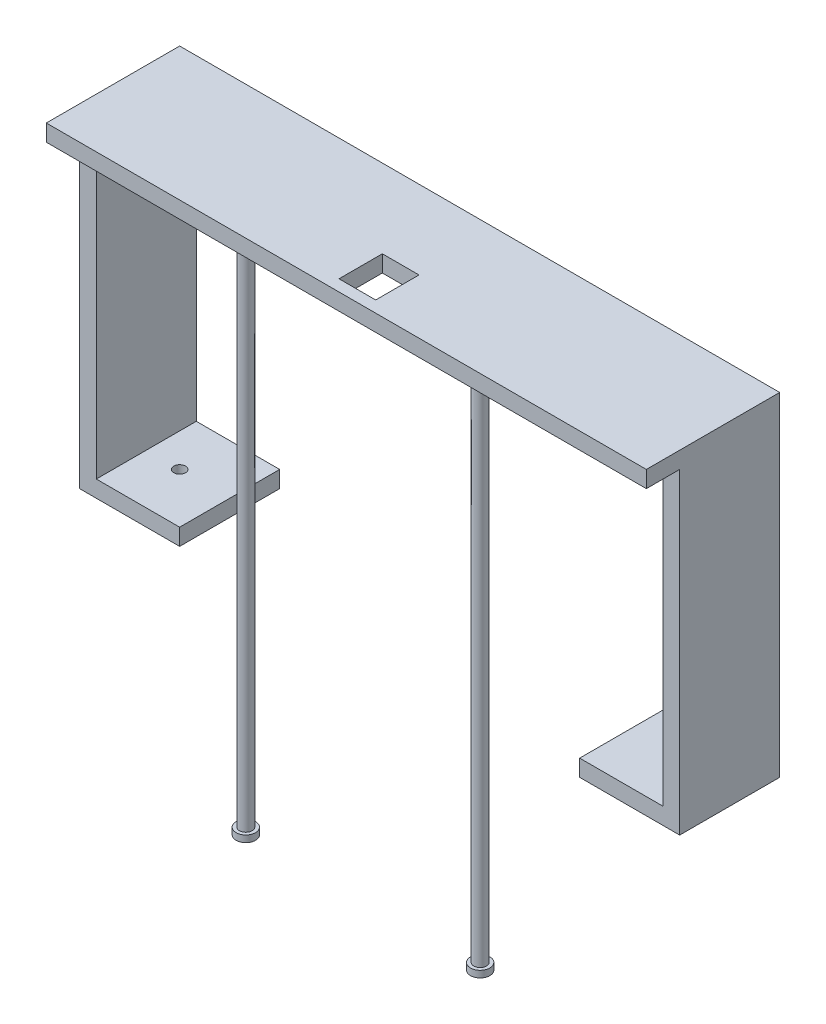
ISO-10303-21;
HEADER;
FILE_DESCRIPTION(('STEP AP214'),'2;1');
FILE_NAME('part.step','',(''),(''),'','','');
FILE_SCHEMA(('AUTOMOTIVE_DESIGN { 1 0 10303 214 1 1 1 1 }'));
ENDSEC;
DATA;
#1=APPLICATION_CONTEXT('core data for automotive mechanical design processes');
#2=APPLICATION_PROTOCOL_DEFINITION('international standard','automotive_design',2000,#1);
#3=PRODUCT_CONTEXT('',#1,'mechanical');
#4=PRODUCT('Part','Part','',(#3));
#5=PRODUCT_RELATED_PRODUCT_CATEGORY('part','',(#4));
#6=PRODUCT_DEFINITION_FORMATION('','',#4);
#7=PRODUCT_DEFINITION_CONTEXT('part definition',#1,'design');
#8=PRODUCT_DEFINITION('design','',#6,#7);
#9=PRODUCT_DEFINITION_SHAPE('','',#8);
#10=(LENGTH_UNIT() NAMED_UNIT(*) SI_UNIT(.MILLI.,.METRE.));
#11=(NAMED_UNIT(*) PLANE_ANGLE_UNIT() SI_UNIT($,.RADIAN.));
#12=(NAMED_UNIT(*) SI_UNIT($,.STERADIAN.) SOLID_ANGLE_UNIT());
#13=UNCERTAINTY_MEASURE_WITH_UNIT(LENGTH_MEASURE(1.E-05),#10,'distance_accuracy_value','');
#14=(GEOMETRIC_REPRESENTATION_CONTEXT(3) GLOBAL_UNCERTAINTY_ASSIGNED_CONTEXT((#13)) GLOBAL_UNIT_ASSIGNED_CONTEXT((#10,
#11,#12)) REPRESENTATION_CONTEXT('',''));
#15=CARTESIAN_POINT('',(0.,0.,0.));
#16=DIRECTION('',(0.,0.,1.));
#17=DIRECTION('',(1.,0.,0.));
#18=AXIS2_PLACEMENT_3D('',#15,#16,#17);
#19=CARTESIAN_POINT('',(125.15,-60.,5.00000000000001));
#20=DIRECTION('',(0.,1.,0.));
#21=DIRECTION('',(-1.,0.,0.));
#22=AXIS2_PLACEMENT_3D('',#19,#20,#21);
#23=CYLINDRICAL_SURFACE('',#22,1.9);
#24=CARTESIAN_POINT('',(125.15,95.,5.00000000000001));
#25=DIRECTION('',(0.,-1.,0.));
#26=DIRECTION('',(-1.,0.,0.));
#27=AXIS2_PLACEMENT_3D('',#24,#25,#26);
#28=CIRCLE('',#27,1.9);
#29=CARTESIAN_POINT('',(123.25,95.,5.00000000000001));
#30=VERTEX_POINT('',#29);
#31=EDGE_CURVE('E214',#30,#30,#28,.T.);
#32=ORIENTED_EDGE('',*,*,#31,.T.);
#33=EDGE_LOOP('',(#32));
#34=FACE_BOUND('',#33,.T.);
#35=CARTESIAN_POINT('',(125.15,-58.,5.00000000000001));
#36=DIRECTION('',(0.,-1.,0.));
#37=DIRECTION('',(1.,0.,0.));
#38=AXIS2_PLACEMENT_3D('',#35,#36,#37);
#39=CIRCLE('',#38,1.9);
#40=CARTESIAN_POINT('',(127.05,-58.,5.00000000000001));
#41=VERTEX_POINT('',#40);
#42=EDGE_CURVE('E11',#41,#41,#39,.T.);
#43=ORIENTED_EDGE('',*,*,#42,.F.);
#44=EDGE_LOOP('',(#43));
#45=FACE_BOUND('',#44,.T.);
#46=ADVANCED_FACE('F38',(#34,#45),#23,.T.);
#47=CARTESIAN_POINT('',(54.8500000000001,-60.,5.00000000000001));
#48=DIRECTION('',(0.,1.,0.));
#49=DIRECTION('',(-1.,0.,0.));
#50=AXIS2_PLACEMENT_3D('',#47,#48,#49);
#51=CYLINDRICAL_SURFACE('',#50,1.9);
#52=CARTESIAN_POINT('',(54.85,95.,5.00000000000001));
#53=DIRECTION('',(0.,-1.,0.));
#54=DIRECTION('',(1.,0.,0.));
#55=AXIS2_PLACEMENT_3D('',#52,#53,#54);
#56=CIRCLE('',#55,1.9);
#57=CARTESIAN_POINT('',(56.75,95.,5.00000000000001));
#58=VERTEX_POINT('',#57);
#59=EDGE_CURVE('E209',#58,#58,#56,.T.);
#60=ORIENTED_EDGE('',*,*,#59,.T.);
#61=EDGE_LOOP('',(#60));
#62=FACE_BOUND('',#61,.T.);
#63=CARTESIAN_POINT('',(54.8500000000001,-58.,5.00000000000001));
#64=DIRECTION('',(0.,-1.,0.));
#65=DIRECTION('',(1.,0.,0.));
#66=AXIS2_PLACEMENT_3D('',#63,#64,#65);
#67=CIRCLE('',#66,1.9);
#68=CARTESIAN_POINT('',(56.75,-58.,5.00000000000001));
#69=VERTEX_POINT('',#68);
#70=EDGE_CURVE('E46',#69,#69,#67,.T.);
#71=ORIENTED_EDGE('',*,*,#70,.F.);
#72=EDGE_LOOP('',(#71));
#73=FACE_BOUND('',#72,.T.);
#74=ADVANCED_FACE('F410',(#62,#73),#51,.T.);
#75=CARTESIAN_POINT('',(0.,0.,0.));
#76=DIRECTION('',(0.,0.,-1.));
#77=DIRECTION('',(-1.,0.,0.));
#78=AXIS2_PLACEMENT_3D('',#75,#76,#77);
#79=PLANE('',#78);
#80=DIRECTION('',(1.,0.,0.));
#81=VECTOR('',#80,1.);
#82=CARTESIAN_POINT('',(0.,95.,0.));
#83=LINE('',#82,#81);
#84=CARTESIAN_POINT('',(0.,95.,0.));
#85=VERTEX_POINT('',#84);
#86=CARTESIAN_POINT('',(5.,95.,0.));
#87=VERTEX_POINT('',#86);
#88=EDGE_CURVE('E217',#85,#87,#83,.T.);
#89=ORIENTED_EDGE('',*,*,#88,.F.);
#90=DIRECTION('',(0.,-1.,0.));
#91=VECTOR('',#90,1.);
#92=CARTESIAN_POINT('',(0.,0.,0.));
#93=LINE('',#92,#91);
#94=CARTESIAN_POINT('',(0.,0.,0.));
#95=VERTEX_POINT('',#94);
#96=EDGE_CURVE('E307',#85,#95,#93,.T.);
#97=ORIENTED_EDGE('',*,*,#96,.T.);
#98=DIRECTION('',(1.,0.,0.));
#99=VECTOR('',#98,1.);
#100=CARTESIAN_POINT('',(30.,0.,0.));
#101=LINE('',#100,#99);
#102=CARTESIAN_POINT('',(30.,0.,0.));
#103=VERTEX_POINT('',#102);
#104=EDGE_CURVE('E249',#95,#103,#101,.T.);
#105=ORIENTED_EDGE('',*,*,#104,.T.);
#106=DIRECTION('',(0.,1.,0.));
#107=VECTOR('',#106,1.);
#108=CARTESIAN_POINT('',(30.,5.,0.));
#109=LINE('',#108,#107);
#110=CARTESIAN_POINT('',(30.,5.,0.));
#111=VERTEX_POINT('',#110);
#112=EDGE_CURVE('E283',#103,#111,#109,.T.);
#113=ORIENTED_EDGE('',*,*,#112,.T.);
#114=DIRECTION('',(-1.,0.,0.));
#115=VECTOR('',#114,1.);
#116=CARTESIAN_POINT('',(5.00000000000002,5.,0.));
#117=LINE('',#116,#115);
#118=CARTESIAN_POINT('',(5.00000000000002,5.,0.));
#119=VERTEX_POINT('',#118);
#120=EDGE_CURVE('E286',#111,#119,#117,.T.);
#121=ORIENTED_EDGE('',*,*,#120,.T.);
#122=DIRECTION('',(0.,1.,0.));
#123=VECTOR('',#122,1.);
#124=CARTESIAN_POINT('',(5.,95.,0.));
#125=LINE('',#124,#123);
#126=EDGE_CURVE('E290',#119,#87,#125,.T.);
#127=ORIENTED_EDGE('',*,*,#126,.T.);
#128=EDGE_LOOP('',(#89,#97,#105,#113,#121,#127));
#129=FACE_BOUND('',#128,.T.);
#130=ADVANCED_FACE('F362',(#129),#79,.F.);
#131=CARTESIAN_POINT('',(175.,95.,0.));
#132=VERTEX_POINT('',#131);
#133=CARTESIAN_POINT('',(180.,95.,0.));
#134=VERTEX_POINT('',#133);
#135=EDGE_CURVE('E232',#132,#134,#83,.T.);
#136=ORIENTED_EDGE('',*,*,#135,.F.);
#137=DIRECTION('',(0.,-1.,0.));
#138=VECTOR('',#137,1.);
#139=CARTESIAN_POINT('',(175.,5.,0.));
#140=LINE('',#139,#138);
#141=CARTESIAN_POINT('',(175.,5.,0.));
#142=VERTEX_POINT('',#141);
#143=EDGE_CURVE('E293',#132,#142,#140,.T.);
#144=ORIENTED_EDGE('',*,*,#143,.T.);
#145=DIRECTION('',(-1.,0.,0.));
#146=VECTOR('',#145,1.);
#147=CARTESIAN_POINT('',(150.,5.,0.));
#148=LINE('',#147,#146);
#149=CARTESIAN_POINT('',(150.,5.,0.));
#150=VERTEX_POINT('',#149);
#151=EDGE_CURVE('E296',#142,#150,#148,.T.);
#152=ORIENTED_EDGE('',*,*,#151,.T.);
#153=DIRECTION('',(0.,-1.,0.));
#154=VECTOR('',#153,1.);
#155=CARTESIAN_POINT('',(150.,0.,0.));
#156=LINE('',#155,#154);
#157=CARTESIAN_POINT('',(150.,0.,0.));
#158=VERTEX_POINT('',#157);
#159=EDGE_CURVE('E299',#150,#158,#156,.T.);
#160=ORIENTED_EDGE('',*,*,#159,.T.);
#161=DIRECTION('',(1.,0.,0.));
#162=VECTOR('',#161,1.);
#163=CARTESIAN_POINT('',(180.,0.,0.));
#164=LINE('',#163,#162);
#165=CARTESIAN_POINT('',(180.,0.,0.));
#166=VERTEX_POINT('',#165);
#167=EDGE_CURVE('E302',#158,#166,#164,.T.);
#168=ORIENTED_EDGE('',*,*,#167,.T.);
#169=DIRECTION('',(0.,1.,0.));
#170=VECTOR('',#169,1.);
#171=CARTESIAN_POINT('',(180.,100.,0.));
#172=LINE('',#171,#170);
#173=EDGE_CURVE('E305',#166,#134,#172,.T.);
#174=ORIENTED_EDGE('',*,*,#173,.T.);
#175=EDGE_LOOP('',(#136,#144,#152,#160,#168,#174));
#176=FACE_BOUND('',#175,.T.);
#177=ADVANCED_FACE('F379',(#176),#79,.F.);
#178=CARTESIAN_POINT('',(30.,5.,-30.));
#179=DIRECTION('',(1.,0.,0.));
#180=DIRECTION('',(0.,0.,-1.));
#181=AXIS2_PLACEMENT_3D('',#178,#179,#180);
#182=PLANE('',#181);
#183=ORIENTED_EDGE('',*,*,#112,.F.);
#184=DIRECTION('',(0.,0.,1.));
#185=VECTOR('',#184,1.);
#186=CARTESIAN_POINT('',(30.,0.,-30.));
#187=LINE('',#186,#185);
#188=CARTESIAN_POINT('',(30.,0.,-30.));
#189=VERTEX_POINT('',#188);
#190=EDGE_CURVE('E311',#189,#103,#187,.T.);
#191=ORIENTED_EDGE('',*,*,#190,.F.);
#192=DIRECTION('',(0.,1.,0.));
#193=VECTOR('',#192,1.);
#194=CARTESIAN_POINT('',(30.,5.,-30.));
#195=LINE('',#194,#193);
#196=CARTESIAN_POINT('',(30.,5.,-30.));
#197=VERTEX_POINT('',#196);
#198=EDGE_CURVE('E245',#189,#197,#195,.T.);
#199=ORIENTED_EDGE('',*,*,#198,.T.);
#200=DIRECTION('',(0.,0.,1.));
#201=VECTOR('',#200,1.);
#202=CARTESIAN_POINT('',(30.,5.,-30.));
#203=LINE('',#202,#201);
#204=EDGE_CURVE('E282',#197,#111,#203,.T.);
#205=ORIENTED_EDGE('',*,*,#204,.T.);
#206=EDGE_LOOP('',(#183,#191,#199,#205));
#207=FACE_BOUND('',#206,.T.);
#208=ADVANCED_FACE('F40',(#207),#182,.T.);
#209=CARTESIAN_POINT('',(30.,0.,-30.));
#210=DIRECTION('',(0.,-1.,0.));
#211=DIRECTION('',(1.,0.,0.));
#212=AXIS2_PLACEMENT_3D('',#209,#210,#211);
#213=PLANE('',#212);
#214=CARTESIAN_POINT('',(15.,0.,-15.));
#215=DIRECTION('',(0.,-1.,0.));
#216=DIRECTION('',(1.,0.,0.));
#217=AXIS2_PLACEMENT_3D('',#214,#215,#216);
#218=CIRCLE('',#217,1.75);
#219=CARTESIAN_POINT('',(16.75,0.,-15.));
#220=VERTEX_POINT('',#219);
#221=EDGE_CURVE('E239',#220,#220,#218,.T.);
#222=ORIENTED_EDGE('',*,*,#221,.F.);
#223=EDGE_LOOP('',(#222));
#224=FACE_BOUND('',#223,.T.);
#225=ORIENTED_EDGE('',*,*,#104,.F.);
#226=DIRECTION('',(0.,0.,1.));
#227=VECTOR('',#226,1.);
#228=CARTESIAN_POINT('',(0.,0.,-30.));
#229=LINE('',#228,#227);
#230=CARTESIAN_POINT('',(0.,0.,-30.));
#231=VERTEX_POINT('',#230);
#232=EDGE_CURVE('E313',#231,#95,#229,.T.);
#233=ORIENTED_EDGE('',*,*,#232,.F.);
#234=DIRECTION('',(1.,0.,0.));
#235=VECTOR('',#234,1.);
#236=CARTESIAN_POINT('',(30.,0.,-30.));
#237=LINE('',#236,#235);
#238=EDGE_CURVE('E279',#231,#189,#237,.T.);
#239=ORIENTED_EDGE('',*,*,#238,.T.);
#240=ORIENTED_EDGE('',*,*,#190,.T.);
#241=EDGE_LOOP('',(#225,#233,#239,#240));
#242=FACE_BOUND('',#241,.T.);
#243=ADVANCED_FACE('F394',(#224,#242),#213,.T.);
#244=CARTESIAN_POINT('',(0.,0.,-30.));
#245=DIRECTION('',(-1.,0.,0.));
#246=DIRECTION('',(0.,0.,1.));
#247=AXIS2_PLACEMENT_3D('',#244,#245,#246);
#248=PLANE('',#247);
#249=ORIENTED_EDGE('',*,*,#96,.F.);
#250=DIRECTION('',(0.,0.,-1.));
#251=VECTOR('',#250,1.);
#252=CARTESIAN_POINT('',(0.,95.,10.));
#253=LINE('',#252,#251);
#254=CARTESIAN_POINT('',(0.,95.,10.));
#255=VERTEX_POINT('',#254);
#256=EDGE_CURVE('E229',#255,#85,#253,.T.);
#257=ORIENTED_EDGE('',*,*,#256,.F.);
#258=DIRECTION('',(0.,-1.,0.));
#259=VECTOR('',#258,1.);
#260=CARTESIAN_POINT('',(0.,0.,10.));
#261=LINE('',#260,#259);
#262=CARTESIAN_POINT('',(0.,100.,10.));
#263=VERTEX_POINT('',#262);
#264=EDGE_CURVE('E227',#263,#255,#261,.T.);
#265=ORIENTED_EDGE('',*,*,#264,.F.);
#266=DIRECTION('',(0.,0.,1.));
#267=VECTOR('',#266,1.);
#268=CARTESIAN_POINT('',(0.,100.,-30.));
#269=LINE('',#268,#267);
#270=CARTESIAN_POINT('',(0.,100.,-30.));
#271=VERTEX_POINT('',#270);
#272=EDGE_CURVE('E316',#271,#263,#269,.T.);
#273=ORIENTED_EDGE('',*,*,#272,.F.);
#274=DIRECTION('',(0.,-1.,0.));
#275=VECTOR('',#274,1.);
#276=CARTESIAN_POINT('',(0.,0.,-30.));
#277=LINE('',#276,#275);
#278=EDGE_CURVE('E276',#271,#231,#277,.T.);
#279=ORIENTED_EDGE('',*,*,#278,.T.);
#280=ORIENTED_EDGE('',*,*,#232,.T.);
#281=EDGE_LOOP('',(#249,#257,#265,#273,#279,#280));
#282=FACE_BOUND('',#281,.T.);
#283=ADVANCED_FACE('F359',(#282),#248,.T.);
#284=CARTESIAN_POINT('',(0.,100.,-30.));
#285=DIRECTION('',(0.,1.,0.));
#286=DIRECTION('',(0.,0.,1.));
#287=AXIS2_PLACEMENT_3D('',#284,#285,#286);
#288=PLANE('',#287);
#289=DIRECTION('',(1.,0.,0.));
#290=VECTOR('',#289,1.);
#291=CARTESIAN_POINT('',(84.3801186215469,100.,-6.42408225382674));
#292=LINE('',#291,#290);
#293=CARTESIAN_POINT('',(84.3801186215469,100.,-6.42408225382674));
#294=VERTEX_POINT('',#293);
#295=CARTESIAN_POINT('',(95.3801186215469,100.,-6.42408225382674));
#296=VERTEX_POINT('',#295);
#297=EDGE_CURVE('E165',#294,#296,#292,.T.);
#298=ORIENTED_EDGE('',*,*,#297,.T.);
#299=DIRECTION('',(0.,0.,1.));
#300=VECTOR('',#299,1.);
#301=CARTESIAN_POINT('',(95.3801186215469,100.,6.57591774617326));
#302=LINE('',#301,#300);
#303=CARTESIAN_POINT('',(95.3801186215469,100.,6.57591774617326));
#304=VERTEX_POINT('',#303);
#305=EDGE_CURVE('E174',#296,#304,#302,.T.);
#306=ORIENTED_EDGE('',*,*,#305,.T.);
#307=DIRECTION('',(-1.,0.,0.));
#308=VECTOR('',#307,1.);
#309=CARTESIAN_POINT('',(84.3801186215469,100.,6.57591774617326));
#310=LINE('',#309,#308);
#311=CARTESIAN_POINT('',(84.3801186215469,100.,6.57591774617326));
#312=VERTEX_POINT('',#311);
#313=EDGE_CURVE('E53',#304,#312,#310,.T.);
#314=ORIENTED_EDGE('',*,*,#313,.T.);
#315=DIRECTION('',(0.,0.,-1.));
#316=VECTOR('',#315,1.);
#317=CARTESIAN_POINT('',(84.3801186215469,100.,6.57591774617326));
#318=LINE('',#317,#316);
#319=EDGE_CURVE('E171',#312,#294,#318,.T.);
#320=ORIENTED_EDGE('',*,*,#319,.T.);
#321=EDGE_LOOP('',(#298,#306,#314,#320));
#322=FACE_BOUND('',#321,.T.);
#323=ORIENTED_EDGE('',*,*,#272,.T.);
#324=DIRECTION('',(-1.,0.,0.));
#325=VECTOR('',#324,1.);
#326=CARTESIAN_POINT('',(0.,100.,10.));
#327=LINE('',#326,#325);
#328=CARTESIAN_POINT('',(180.,100.,10.));
#329=VERTEX_POINT('',#328);
#330=EDGE_CURVE('E224',#329,#263,#327,.T.);
#331=ORIENTED_EDGE('',*,*,#330,.F.);
#332=DIRECTION('',(0.,0.,1.));
#333=VECTOR('',#332,1.);
#334=CARTESIAN_POINT('',(180.,100.,-30.));
#335=LINE('',#334,#333);
#336=CARTESIAN_POINT('',(180.,100.,-30.));
#337=VERTEX_POINT('',#336);
#338=EDGE_CURVE('E318',#337,#329,#335,.T.);
#339=ORIENTED_EDGE('',*,*,#338,.F.);
#340=DIRECTION('',(-1.,0.,0.));
#341=VECTOR('',#340,1.);
#342=CARTESIAN_POINT('',(0.,100.,-30.));
#343=LINE('',#342,#341);
#344=EDGE_CURVE('E273',#337,#271,#343,.T.);
#345=ORIENTED_EDGE('',*,*,#344,.T.);
#346=EDGE_LOOP('',(#323,#331,#339,#345));
#347=FACE_BOUND('',#346,.T.);
#348=ADVANCED_FACE('F178',(#322,#347),#288,.T.);
#349=CARTESIAN_POINT('',(180.,100.,-30.));
#350=DIRECTION('',(1.,0.,0.));
#351=DIRECTION('',(0.,0.,-1.));
#352=AXIS2_PLACEMENT_3D('',#349,#350,#351);
#353=PLANE('',#352);
#354=ORIENTED_EDGE('',*,*,#173,.F.);
#355=DIRECTION('',(0.,0.,1.));
#356=VECTOR('',#355,1.);
#357=CARTESIAN_POINT('',(180.,0.,-30.));
#358=LINE('',#357,#356);
#359=CARTESIAN_POINT('',(180.,0.,-30.));
#360=VERTEX_POINT('',#359);
#361=EDGE_CURVE('E320',#360,#166,#358,.T.);
#362=ORIENTED_EDGE('',*,*,#361,.F.);
#363=DIRECTION('',(0.,1.,0.));
#364=VECTOR('',#363,1.);
#365=CARTESIAN_POINT('',(180.,100.,-30.));
#366=LINE('',#365,#364);
#367=EDGE_CURVE('E270',#360,#337,#366,.T.);
#368=ORIENTED_EDGE('',*,*,#367,.T.);
#369=ORIENTED_EDGE('',*,*,#338,.T.);
#370=DIRECTION('',(0.,1.,0.));
#371=VECTOR('',#370,1.);
#372=CARTESIAN_POINT('',(180.,0.,10.));
#373=LINE('',#372,#371);
#374=CARTESIAN_POINT('',(180.,95.,10.));
#375=VERTEX_POINT('',#374);
#376=EDGE_CURVE('E221',#375,#329,#373,.T.);
#377=ORIENTED_EDGE('',*,*,#376,.F.);
#378=DIRECTION('',(0.,0.,-1.));
#379=VECTOR('',#378,1.);
#380=CARTESIAN_POINT('',(180.,95.,10.));
#381=LINE('',#380,#379);
#382=EDGE_CURVE('E235',#375,#134,#381,.T.);
#383=ORIENTED_EDGE('',*,*,#382,.T.);
#384=EDGE_LOOP('',(#354,#362,#368,#369,#377,#383));
#385=FACE_BOUND('',#384,.T.);
#386=ADVANCED_FACE('F351',(#385),#353,.T.);
#387=CARTESIAN_POINT('',(180.,0.,-30.));
#388=DIRECTION('',(0.,-1.,0.));
#389=DIRECTION('',(1.,0.,0.));
#390=AXIS2_PLACEMENT_3D('',#387,#388,#389);
#391=PLANE('',#390);
#392=CARTESIAN_POINT('',(165.,0.,-15.));
#393=DIRECTION('',(0.,-1.,0.));
#394=DIRECTION('',(-1.,0.,0.));
#395=AXIS2_PLACEMENT_3D('',#392,#393,#394);
#396=CIRCLE('',#395,1.75000000000001);
#397=CARTESIAN_POINT('',(163.25,0.,-15.));
#398=VERTEX_POINT('',#397);
#399=EDGE_CURVE('E238',#398,#398,#396,.T.);
#400=ORIENTED_EDGE('',*,*,#399,.F.);
#401=EDGE_LOOP('',(#400));
#402=FACE_BOUND('',#401,.T.);
#403=ORIENTED_EDGE('',*,*,#167,.F.);
#404=DIRECTION('',(0.,0.,1.));
#405=VECTOR('',#404,1.);
#406=CARTESIAN_POINT('',(150.,0.,-30.));
#407=LINE('',#406,#405);
#408=CARTESIAN_POINT('',(150.,0.,-30.));
#409=VERTEX_POINT('',#408);
#410=EDGE_CURVE('E322',#409,#158,#407,.T.);
#411=ORIENTED_EDGE('',*,*,#410,.F.);
#412=DIRECTION('',(1.,0.,0.));
#413=VECTOR('',#412,1.);
#414=CARTESIAN_POINT('',(180.,0.,-30.));
#415=LINE('',#414,#413);
#416=EDGE_CURVE('E267',#409,#360,#415,.T.);
#417=ORIENTED_EDGE('',*,*,#416,.T.);
#418=ORIENTED_EDGE('',*,*,#361,.T.);
#419=EDGE_LOOP('',(#403,#411,#417,#418));
#420=FACE_BOUND('',#419,.T.);
#421=ADVANCED_FACE('F388',(#402,#420),#391,.T.);
#422=CARTESIAN_POINT('',(150.,0.,-30.));
#423=DIRECTION('',(-1.,0.,0.));
#424=DIRECTION('',(0.,0.,1.));
#425=AXIS2_PLACEMENT_3D('',#422,#423,#424);
#426=PLANE('',#425);
#427=ORIENTED_EDGE('',*,*,#159,.F.);
#428=DIRECTION('',(0.,0.,1.));
#429=VECTOR('',#428,1.);
#430=CARTESIAN_POINT('',(150.,5.,-30.));
#431=LINE('',#430,#429);
#432=CARTESIAN_POINT('',(150.,5.,-30.));
#433=VERTEX_POINT('',#432);
#434=EDGE_CURVE('E324',#433,#150,#431,.T.);
#435=ORIENTED_EDGE('',*,*,#434,.F.);
#436=DIRECTION('',(0.,-1.,0.));
#437=VECTOR('',#436,1.);
#438=CARTESIAN_POINT('',(150.,0.,-30.));
#439=LINE('',#438,#437);
#440=EDGE_CURVE('E264',#433,#409,#439,.T.);
#441=ORIENTED_EDGE('',*,*,#440,.T.);
#442=ORIENTED_EDGE('',*,*,#410,.T.);
#443=EDGE_LOOP('',(#427,#435,#441,#442));
#444=FACE_BOUND('',#443,.T.);
#445=ADVANCED_FACE('F384',(#444),#426,.T.);
#446=CARTESIAN_POINT('',(150.,5.,-30.));
#447=DIRECTION('',(0.,1.,0.));
#448=DIRECTION('',(0.,0.,1.));
#449=AXIS2_PLACEMENT_3D('',#446,#447,#448);
#450=PLANE('',#449);
#451=CARTESIAN_POINT('',(165.,5.,-15.));
#452=DIRECTION('',(0.,1.,0.));
#453=DIRECTION('',(0.,0.,1.));
#454=AXIS2_PLACEMENT_3D('',#451,#452,#453);
#455=CIRCLE('',#454,1.75000000000001);
#456=CARTESIAN_POINT('',(165.,5.,-13.25));
#457=VERTEX_POINT('',#456);
#458=EDGE_CURVE('E287',#457,#457,#455,.T.);
#459=ORIENTED_EDGE('',*,*,#458,.F.);
#460=EDGE_LOOP('',(#459));
#461=FACE_BOUND('',#460,.T.);
#462=ORIENTED_EDGE('',*,*,#151,.F.);
#463=DIRECTION('',(0.,0.,1.));
#464=VECTOR('',#463,1.);
#465=CARTESIAN_POINT('',(175.,5.,-30.));
#466=LINE('',#465,#464);
#467=CARTESIAN_POINT('',(175.,5.,-30.));
#468=VERTEX_POINT('',#467);
#469=EDGE_CURVE('E326',#468,#142,#466,.T.);
#470=ORIENTED_EDGE('',*,*,#469,.F.);
#471=DIRECTION('',(-1.,0.,0.));
#472=VECTOR('',#471,1.);
#473=CARTESIAN_POINT('',(150.,5.,-30.));
#474=LINE('',#473,#472);
#475=EDGE_CURVE('E261',#468,#433,#474,.T.);
#476=ORIENTED_EDGE('',*,*,#475,.T.);
#477=ORIENTED_EDGE('',*,*,#434,.T.);
#478=EDGE_LOOP('',(#462,#470,#476,#477));
#479=FACE_BOUND('',#478,.T.);
#480=ADVANCED_FACE('F382',(#461,#479),#450,.T.);
#481=CARTESIAN_POINT('',(175.,5.,-30.));
#482=DIRECTION('',(-1.,0.,0.));
#483=DIRECTION('',(0.,0.,1.));
#484=AXIS2_PLACEMENT_3D('',#481,#482,#483);
#485=PLANE('',#484);
#486=ORIENTED_EDGE('',*,*,#143,.F.);
#487=DIRECTION('',(0.,0.,1.));
#488=VECTOR('',#487,1.);
#489=CARTESIAN_POINT('',(175.,95.,-30.));
#490=LINE('',#489,#488);
#491=CARTESIAN_POINT('',(175.,95.,-30.));
#492=VERTEX_POINT('',#491);
#493=EDGE_CURVE('E328',#492,#132,#490,.T.);
#494=ORIENTED_EDGE('',*,*,#493,.F.);
#495=DIRECTION('',(0.,-1.,0.));
#496=VECTOR('',#495,1.);
#497=CARTESIAN_POINT('',(175.,5.,-30.));
#498=LINE('',#497,#496);
#499=EDGE_CURVE('E258',#492,#468,#498,.T.);
#500=ORIENTED_EDGE('',*,*,#499,.T.);
#501=ORIENTED_EDGE('',*,*,#469,.T.);
#502=EDGE_LOOP('',(#486,#494,#500,#501));
#503=FACE_BOUND('',#502,.T.);
#504=ADVANCED_FACE('F377',(#503),#485,.T.);
#505=CARTESIAN_POINT('',(175.,95.,-30.));
#506=DIRECTION('',(0.,-1.,0.));
#507=DIRECTION('',(1.,0.,0.));
#508=AXIS2_PLACEMENT_3D('',#505,#506,#507);
#509=PLANE('',#508);
#510=DIRECTION('',(1.,0.,0.));
#511=VECTOR('',#510,1.);
#512=CARTESIAN_POINT('',(84.3801186215469,95.,-6.42408225382674));
#513=LINE('',#512,#511);
#514=CARTESIAN_POINT('',(84.3801186215469,95.,-6.42408225382674));
#515=VERTEX_POINT('',#514);
#516=CARTESIAN_POINT('',(95.3801186215469,95.,-6.42408225382674));
#517=VERTEX_POINT('',#516);
#518=EDGE_CURVE('E61',#515,#517,#513,.T.);
#519=ORIENTED_EDGE('',*,*,#518,.F.);
#520=DIRECTION('',(0.,0.,-1.));
#521=VECTOR('',#520,1.);
#522=CARTESIAN_POINT('',(84.3801186215469,95.,6.57591774617326));
#523=LINE('',#522,#521);
#524=CARTESIAN_POINT('',(84.3801186215469,95.,6.57591774617326));
#525=VERTEX_POINT('',#524);
#526=EDGE_CURVE('E181',#525,#515,#523,.T.);
#527=ORIENTED_EDGE('',*,*,#526,.F.);
#528=DIRECTION('',(-1.,0.,0.));
#529=VECTOR('',#528,1.);
#530=CARTESIAN_POINT('',(84.3801186215469,95.,6.57591774617326));
#531=LINE('',#530,#529);
#532=CARTESIAN_POINT('',(95.3801186215469,95.,6.57591774617326));
#533=VERTEX_POINT('',#532);
#534=EDGE_CURVE('E184',#533,#525,#531,.T.);
#535=ORIENTED_EDGE('',*,*,#534,.F.);
#536=DIRECTION('',(0.,0.,1.));
#537=VECTOR('',#536,1.);
#538=CARTESIAN_POINT('',(95.3801186215469,95.,6.57591774617326));
#539=LINE('',#538,#537);
#540=EDGE_CURVE('E190',#517,#533,#539,.T.);
#541=ORIENTED_EDGE('',*,*,#540,.F.);
#542=EDGE_LOOP('',(#519,#527,#535,#541));
#543=FACE_BOUND('',#542,.T.);
#544=ORIENTED_EDGE('',*,*,#59,.F.);
#545=EDGE_LOOP('',(#544));
#546=FACE_BOUND('',#545,.T.);
#547=ORIENTED_EDGE('',*,*,#31,.F.);
#548=EDGE_LOOP('',(#547));
#549=FACE_BOUND('',#548,.T.);
#550=ORIENTED_EDGE('',*,*,#493,.T.);
#551=ORIENTED_EDGE('',*,*,#135,.T.);
#552=ORIENTED_EDGE('',*,*,#382,.F.);
#553=DIRECTION('',(1.,0.,0.));
#554=VECTOR('',#553,1.);
#555=CARTESIAN_POINT('',(0.,95.,10.));
#556=LINE('',#555,#554);
#557=EDGE_CURVE('E218',#255,#375,#556,.T.);
#558=ORIENTED_EDGE('',*,*,#557,.F.);
#559=ORIENTED_EDGE('',*,*,#256,.T.);
#560=ORIENTED_EDGE('',*,*,#88,.T.);
#561=DIRECTION('',(0.,0.,1.));
#562=VECTOR('',#561,1.);
#563=CARTESIAN_POINT('',(5.,95.,-30.));
#564=LINE('',#563,#562);
#565=CARTESIAN_POINT('',(5.,95.,-30.));
#566=VERTEX_POINT('',#565);
#567=EDGE_CURVE('E331',#566,#87,#564,.T.);
#568=ORIENTED_EDGE('',*,*,#567,.F.);
#569=DIRECTION('',(1.,0.,0.));
#570=VECTOR('',#569,1.);
#571=CARTESIAN_POINT('',(175.,95.,-30.));
#572=LINE('',#571,#570);
#573=EDGE_CURVE('E255',#566,#492,#572,.T.);
#574=ORIENTED_EDGE('',*,*,#573,.T.);
#575=EDGE_LOOP('',(#550,#551,#552,#558,#559,#560,#568,#574));
#576=FACE_BOUND('',#575,.T.);
#577=ADVANCED_FACE('F345',(#543,#546,#549,#576),#509,.T.);
#578=CARTESIAN_POINT('',(5.,95.,-30.));
#579=DIRECTION('',(1.,0.,0.));
#580=DIRECTION('',(0.,1.,0.));
#581=AXIS2_PLACEMENT_3D('',#578,#579,#580);
#582=PLANE('',#581);
#583=ORIENTED_EDGE('',*,*,#126,.F.);
#584=DIRECTION('',(0.,0.,1.));
#585=VECTOR('',#584,1.);
#586=CARTESIAN_POINT('',(5.00000000000002,5.,-30.));
#587=LINE('',#586,#585);
#588=CARTESIAN_POINT('',(5.00000000000002,5.,-30.));
#589=VERTEX_POINT('',#588);
#590=EDGE_CURVE('E333',#589,#119,#587,.T.);
#591=ORIENTED_EDGE('',*,*,#590,.F.);
#592=DIRECTION('',(0.,1.,0.));
#593=VECTOR('',#592,1.);
#594=CARTESIAN_POINT('',(5.,95.,-30.));
#595=LINE('',#594,#593);
#596=EDGE_CURVE('E252',#589,#566,#595,.T.);
#597=ORIENTED_EDGE('',*,*,#596,.T.);
#598=ORIENTED_EDGE('',*,*,#567,.T.);
#599=EDGE_LOOP('',(#583,#591,#597,#598));
#600=FACE_BOUND('',#599,.T.);
#601=ADVANCED_FACE('F366',(#600),#582,.T.);
#602=CARTESIAN_POINT('',(5.00000000000002,5.,-30.));
#603=DIRECTION('',(0.,1.,0.));
#604=DIRECTION('',(-1.,0.,0.));
#605=AXIS2_PLACEMENT_3D('',#602,#603,#604);
#606=PLANE('',#605);
#607=CARTESIAN_POINT('',(15.,5.,-15.));
#608=DIRECTION('',(0.,1.,0.));
#609=DIRECTION('',(-1.,0.,0.));
#610=AXIS2_PLACEMENT_3D('',#607,#608,#609);
#611=CIRCLE('',#610,1.75);
#612=CARTESIAN_POINT('',(13.25,5.,-15.));
#613=VERTEX_POINT('',#612);
#614=EDGE_CURVE('E242',#613,#613,#611,.T.);
#615=ORIENTED_EDGE('',*,*,#614,.F.);
#616=EDGE_LOOP('',(#615));
#617=FACE_BOUND('',#616,.T.);
#618=ORIENTED_EDGE('',*,*,#120,.F.);
#619=ORIENTED_EDGE('',*,*,#204,.F.);
#620=DIRECTION('',(-1.,0.,0.));
#621=VECTOR('',#620,1.);
#622=CARTESIAN_POINT('',(5.00000000000002,5.,-30.));
#623=LINE('',#622,#621);
#624=EDGE_CURVE('E248',#197,#589,#623,.T.);
#625=ORIENTED_EDGE('',*,*,#624,.T.);
#626=ORIENTED_EDGE('',*,*,#590,.T.);
#627=EDGE_LOOP('',(#618,#619,#625,#626));
#628=FACE_BOUND('',#627,.T.);
#629=ADVANCED_FACE('F398',(#617,#628),#606,.T.);
#630=CARTESIAN_POINT('',(0.,0.,-30.));
#631=DIRECTION('',(0.,0.,-1.));
#632=DIRECTION('',(-1.,0.,0.));
#633=AXIS2_PLACEMENT_3D('',#630,#631,#632);
#634=PLANE('',#633);
#635=ORIENTED_EDGE('',*,*,#198,.F.);
#636=ORIENTED_EDGE('',*,*,#238,.F.);
#637=ORIENTED_EDGE('',*,*,#278,.F.);
#638=ORIENTED_EDGE('',*,*,#344,.F.);
#639=ORIENTED_EDGE('',*,*,#367,.F.);
#640=ORIENTED_EDGE('',*,*,#416,.F.);
#641=ORIENTED_EDGE('',*,*,#440,.F.);
#642=ORIENTED_EDGE('',*,*,#475,.F.);
#643=ORIENTED_EDGE('',*,*,#499,.F.);
#644=ORIENTED_EDGE('',*,*,#573,.F.);
#645=ORIENTED_EDGE('',*,*,#596,.F.);
#646=ORIENTED_EDGE('',*,*,#624,.F.);
#647=EDGE_LOOP('',(#635,#636,#637,#638,#639,#640,#641,#642,#643,#644,#645,#646));
#648=FACE_BOUND('',#647,.T.);
#649=ADVANCED_FACE('F372',(#648),#634,.T.);
#650=CARTESIAN_POINT('',(15.,10.,-15.));
#651=DIRECTION('',(0.,-1.,0.));
#652=DIRECTION('',(1.,0.,0.));
#653=AXIS2_PLACEMENT_3D('',#650,#651,#652);
#654=CYLINDRICAL_SURFACE('',#653,1.75);
#655=ORIENTED_EDGE('',*,*,#614,.T.);
#656=EDGE_LOOP('',(#655));
#657=FACE_BOUND('',#656,.T.);
#658=ORIENTED_EDGE('',*,*,#221,.T.);
#659=EDGE_LOOP('',(#658));
#660=FACE_BOUND('',#659,.T.);
#661=ADVANCED_FACE('F405',(#657,#660),#654,.F.);
#662=CARTESIAN_POINT('',(165.,9.99999999999999,-15.));
#663=DIRECTION('',(0.,-1.,0.));
#664=DIRECTION('',(1.,0.,0.));
#665=AXIS2_PLACEMENT_3D('',#662,#663,#664);
#666=CYLINDRICAL_SURFACE('',#665,1.75000000000001);
#667=ORIENTED_EDGE('',*,*,#458,.T.);
#668=EDGE_LOOP('',(#667));
#669=FACE_BOUND('',#668,.T.);
#670=ORIENTED_EDGE('',*,*,#399,.T.);
#671=EDGE_LOOP('',(#670));
#672=FACE_BOUND('',#671,.T.);
#673=ADVANCED_FACE('F429',(#669,#672),#666,.F.);
#674=CARTESIAN_POINT('',(0.,0.,10.));
#675=DIRECTION('',(0.,0.,1.));
#676=DIRECTION('',(1.,0.,0.));
#677=AXIS2_PLACEMENT_3D('',#674,#675,#676);
#678=PLANE('',#677);
#679=ORIENTED_EDGE('',*,*,#557,.T.);
#680=ORIENTED_EDGE('',*,*,#376,.T.);
#681=ORIENTED_EDGE('',*,*,#330,.T.);
#682=ORIENTED_EDGE('',*,*,#264,.T.);
#683=EDGE_LOOP('',(#679,#680,#681,#682));
#684=FACE_BOUND('',#683,.T.);
#685=ADVANCED_FACE('F354',(#684),#678,.T.);
#686=CARTESIAN_POINT('',(54.85,-58.,5.00000000000001));
#687=DIRECTION('',(0.,-1.,0.));
#688=DIRECTION('',(1.,0.,0.));
#689=AXIS2_PLACEMENT_3D('',#686,#687,#688);
#690=CYLINDRICAL_SURFACE('',#689,2.9);
#691=CARTESIAN_POINT('',(54.85,-58.,5.00000000000001));
#692=DIRECTION('',(0.,-1.,0.));
#693=DIRECTION('',(1.,0.,0.));
#694=AXIS2_PLACEMENT_3D('',#691,#692,#693);
#695=CIRCLE('',#694,2.9);
#696=CARTESIAN_POINT('',(57.75,-58.,5.00000000000001));
#697=VERTEX_POINT('',#696);
#698=EDGE_CURVE('E206',#697,#697,#695,.T.);
#699=ORIENTED_EDGE('',*,*,#698,.T.);
#700=EDGE_LOOP('',(#699));
#701=FACE_BOUND('',#700,.T.);
#702=CARTESIAN_POINT('',(54.85,-60.,5.00000000000001));
#703=DIRECTION('',(0.,-1.,0.));
#704=DIRECTION('',(1.,0.,0.));
#705=AXIS2_PLACEMENT_3D('',#702,#703,#704);
#706=CIRCLE('',#705,2.9);
#707=CARTESIAN_POINT('',(57.75,-60.,5.00000000000001));
#708=VERTEX_POINT('',#707);
#709=EDGE_CURVE('E203',#708,#708,#706,.T.);
#710=ORIENTED_EDGE('',*,*,#709,.F.);
#711=EDGE_LOOP('',(#710));
#712=FACE_BOUND('',#711,.T.);
#713=ADVANCED_FACE('F428',(#701,#712),#690,.T.);
#714=CARTESIAN_POINT('',(54.85,-58.,5.00000000000001));
#715=DIRECTION('',(0.,-1.,0.));
#716=DIRECTION('',(1.,0.,0.));
#717=AXIS2_PLACEMENT_3D('',#714,#715,#716);
#718=PLANE('',#717);
#719=ORIENTED_EDGE('',*,*,#70,.T.);
#720=EDGE_LOOP('',(#719));
#721=FACE_BOUND('',#720,.T.);
#722=ORIENTED_EDGE('',*,*,#698,.F.);
#723=EDGE_LOOP('',(#722));
#724=FACE_BOUND('',#723,.T.);
#725=ADVANCED_FACE('F490',(#721,#724),#718,.F.);
#726=CARTESIAN_POINT('',(54.8500000000001,-60.,5.00000000000001));
#727=DIRECTION('',(0.,-1.,0.));
#728=DIRECTION('',(1.,0.,0.));
#729=AXIS2_PLACEMENT_3D('',#726,#727,#728);
#730=PLANE('',#729);
#731=ORIENTED_EDGE('',*,*,#709,.T.);
#732=EDGE_LOOP('',(#731));
#733=FACE_BOUND('',#732,.T.);
#734=ADVANCED_FACE('F485',(#733),#730,.T.);
#735=CARTESIAN_POINT('',(125.15,-58.,5.00000000000001));
#736=DIRECTION('',(0.,-1.,0.));
#737=DIRECTION('',(1.,0.,0.));
#738=AXIS2_PLACEMENT_3D('',#735,#736,#737);
#739=CYLINDRICAL_SURFACE('',#738,2.90000000000001);
#740=CARTESIAN_POINT('',(125.15,-58.,5.00000000000001));
#741=DIRECTION('',(0.,-1.,0.));
#742=DIRECTION('',(1.,0.,0.));
#743=AXIS2_PLACEMENT_3D('',#740,#741,#742);
#744=CIRCLE('',#743,2.90000000000001);
#745=CARTESIAN_POINT('',(128.05,-58.,5.00000000000001));
#746=VERTEX_POINT('',#745);
#747=EDGE_CURVE('E196',#746,#746,#744,.T.);
#748=ORIENTED_EDGE('',*,*,#747,.T.);
#749=EDGE_LOOP('',(#748));
#750=FACE_BOUND('',#749,.T.);
#751=CARTESIAN_POINT('',(125.15,-60.,5.00000000000001));
#752=DIRECTION('',(0.,-1.,0.));
#753=DIRECTION('',(1.,0.,0.));
#754=AXIS2_PLACEMENT_3D('',#751,#752,#753);
#755=CIRCLE('',#754,2.90000000000001);
#756=CARTESIAN_POINT('',(128.05,-60.,5.00000000000001));
#757=VERTEX_POINT('',#756);
#758=EDGE_CURVE('E200',#757,#757,#755,.T.);
#759=ORIENTED_EDGE('',*,*,#758,.F.);
#760=EDGE_LOOP('',(#759));
#761=FACE_BOUND('',#760,.T.);
#762=ADVANCED_FACE('F482',(#750,#761),#739,.T.);
#763=CARTESIAN_POINT('',(125.15,-58.,5.00000000000001));
#764=DIRECTION('',(0.,-1.,0.));
#765=DIRECTION('',(1.,0.,0.));
#766=AXIS2_PLACEMENT_3D('',#763,#764,#765);
#767=PLANE('',#766);
#768=ORIENTED_EDGE('',*,*,#42,.T.);
#769=EDGE_LOOP('',(#768));
#770=FACE_BOUND('',#769,.T.);
#771=ORIENTED_EDGE('',*,*,#747,.F.);
#772=EDGE_LOOP('',(#771));
#773=FACE_BOUND('',#772,.T.);
#774=ADVANCED_FACE('F424',(#770,#773),#767,.F.);
#775=CARTESIAN_POINT('',(125.15,-60.,5.00000000000001));
#776=DIRECTION('',(0.,1.,0.));
#777=DIRECTION('',(-1.,0.,0.));
#778=AXIS2_PLACEMENT_3D('',#775,#776,#777);
#779=PLANE('',#778);
#780=ORIENTED_EDGE('',*,*,#758,.T.);
#781=EDGE_LOOP('',(#780));
#782=FACE_BOUND('',#781,.T.);
#783=ADVANCED_FACE('F421',(#782),#779,.F.);
#784=CARTESIAN_POINT('',(84.3801186215469,100.,-6.42408225382674));
#785=DIRECTION('',(0.,0.,-1.));
#786=DIRECTION('',(-1.,0.,0.));
#787=AXIS2_PLACEMENT_3D('',#784,#785,#786);
#788=PLANE('',#787);
#789=ORIENTED_EDGE('',*,*,#518,.T.);
#790=DIRECTION('',(0.,-1.,0.));
#791=VECTOR('',#790,1.);
#792=CARTESIAN_POINT('',(95.3801186215469,100.,-6.42408225382674));
#793=LINE('',#792,#791);
#794=EDGE_CURVE('E161',#296,#517,#793,.T.);
#795=ORIENTED_EDGE('',*,*,#794,.F.);
#796=ORIENTED_EDGE('',*,*,#297,.F.);
#797=DIRECTION('',(0.,-1.,0.));
#798=VECTOR('',#797,1.);
#799=CARTESIAN_POINT('',(84.3801186215469,100.,-6.42408225382674));
#800=LINE('',#799,#798);
#801=EDGE_CURVE('E194',#294,#515,#800,.T.);
#802=ORIENTED_EDGE('',*,*,#801,.T.);
#803=EDGE_LOOP('',(#789,#795,#796,#802));
#804=FACE_BOUND('',#803,.T.);
#805=ADVANCED_FACE('F163',(#804),#788,.F.);
#806=CARTESIAN_POINT('',(84.3801186215469,100.,6.57591774617326));
#807=DIRECTION('',(-1.,0.,0.));
#808=DIRECTION('',(0.,-1.,0.));
#809=AXIS2_PLACEMENT_3D('',#806,#807,#808);
#810=PLANE('',#809);
#811=ORIENTED_EDGE('',*,*,#526,.T.);
#812=ORIENTED_EDGE('',*,*,#801,.F.);
#813=ORIENTED_EDGE('',*,*,#319,.F.);
#814=DIRECTION('',(0.,-1.,0.));
#815=VECTOR('',#814,1.);
#816=CARTESIAN_POINT('',(84.3801186215469,100.,6.57591774617326));
#817=LINE('',#816,#815);
#818=EDGE_CURVE('E197',#312,#525,#817,.T.);
#819=ORIENTED_EDGE('',*,*,#818,.T.);
#820=EDGE_LOOP('',(#811,#812,#813,#819));
#821=FACE_BOUND('',#820,.T.);
#822=ADVANCED_FACE('F470',(#821),#810,.F.);
#823=CARTESIAN_POINT('',(84.3801186215469,100.,6.57591774617326));
#824=DIRECTION('',(0.,0.,1.));
#825=DIRECTION('',(1.,0.,0.));
#826=AXIS2_PLACEMENT_3D('',#823,#824,#825);
#827=PLANE('',#826);
#828=ORIENTED_EDGE('',*,*,#534,.T.);
#829=ORIENTED_EDGE('',*,*,#818,.F.);
#830=ORIENTED_EDGE('',*,*,#313,.F.);
#831=DIRECTION('',(0.,-1.,0.));
#832=VECTOR('',#831,1.);
#833=CARTESIAN_POINT('',(95.3801186215469,100.,6.57591774617326));
#834=LINE('',#833,#832);
#835=EDGE_CURVE('E170',#304,#533,#834,.T.);
#836=ORIENTED_EDGE('',*,*,#835,.T.);
#837=EDGE_LOOP('',(#828,#829,#830,#836));
#838=FACE_BOUND('',#837,.T.);
#839=ADVANCED_FACE('F468',(#838),#827,.F.);
#840=CARTESIAN_POINT('',(95.3801186215469,100.,6.57591774617326));
#841=DIRECTION('',(1.,0.,0.));
#842=DIRECTION('',(0.,1.,0.));
#843=AXIS2_PLACEMENT_3D('',#840,#841,#842);
#844=PLANE('',#843);
#845=ORIENTED_EDGE('',*,*,#540,.T.);
#846=ORIENTED_EDGE('',*,*,#835,.F.);
#847=ORIENTED_EDGE('',*,*,#305,.F.);
#848=ORIENTED_EDGE('',*,*,#794,.T.);
#849=EDGE_LOOP('',(#845,#846,#847,#848));
#850=FACE_BOUND('',#849,.T.);
#851=ADVANCED_FACE('F175',(#850),#844,.F.);
#852=CLOSED_SHELL('',(#46,#74,#130,#177,#208,#243,#283,#348,#386,#421,#445,#480,#504,#577,#601,
#629,#649,#661,#673,#685,#713,#725,#734,#762,#774,#783,#805,#822,#839,#851));
#853=MANIFOLD_SOLID_BREP('B2',#852);
#854=ADVANCED_BREP_SHAPE_REPRESENTATION('',(#18,#853),#14);
#855=SHAPE_DEFINITION_REPRESENTATION(#9,#854);
ENDSEC;
END-ISO-10303-21;
